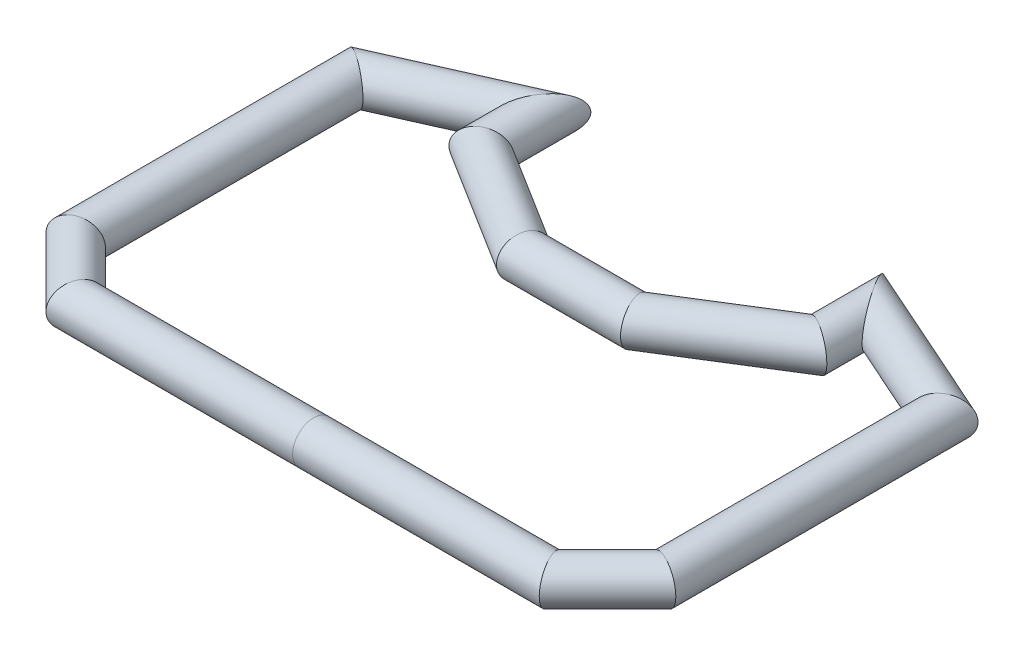
ISO-10303-21;
HEADER;
FILE_DESCRIPTION(('STEP AP214'),'2;1');
FILE_NAME('part.step','',(''),(''),'','','');
FILE_SCHEMA(('AUTOMOTIVE_DESIGN { 1 0 10303 214 1 1 1 1 }'));
ENDSEC;
DATA;
#1=APPLICATION_CONTEXT('core data for automotive mechanical design processes');
#2=APPLICATION_PROTOCOL_DEFINITION('international standard','automotive_design',2000,#1);
#3=PRODUCT_CONTEXT('',#1,'mechanical');
#4=PRODUCT('Part','Part','',(#3));
#5=PRODUCT_RELATED_PRODUCT_CATEGORY('part','',(#4));
#6=PRODUCT_DEFINITION_FORMATION('','',#4);
#7=PRODUCT_DEFINITION_CONTEXT('part definition',#1,'design');
#8=PRODUCT_DEFINITION('design','',#6,#7);
#9=PRODUCT_DEFINITION_SHAPE('','',#8);
#10=(LENGTH_UNIT() NAMED_UNIT(*) SI_UNIT(.MILLI.,.METRE.));
#11=(NAMED_UNIT(*) PLANE_ANGLE_UNIT() SI_UNIT($,.RADIAN.));
#12=(NAMED_UNIT(*) SI_UNIT($,.STERADIAN.) SOLID_ANGLE_UNIT());
#13=UNCERTAINTY_MEASURE_WITH_UNIT(LENGTH_MEASURE(1.E-05),#10,'distance_accuracy_value','');
#14=(GEOMETRIC_REPRESENTATION_CONTEXT(3) GLOBAL_UNCERTAINTY_ASSIGNED_CONTEXT((#13)) GLOBAL_UNIT_ASSIGNED_CONTEXT((#10,
#11,#12)) REPRESENTATION_CONTEXT('',''));
#15=CARTESIAN_POINT('',(0.,0.,0.));
#16=DIRECTION('',(0.,0.,1.));
#17=DIRECTION('',(1.,0.,0.));
#18=AXIS2_PLACEMENT_3D('',#15,#16,#17);
#19=CARTESIAN_POINT('',(45.618887306283,0.,186.6117534618));
#20=DIRECTION('',(0.847998304005083,0.,-0.529998940003187));
#21=DIRECTION('',(-0.529998940003187,0.,-0.847998304005083));
#22=AXIS2_PLACEMENT_3D('',#19,#20,#21);
#23=CYLINDRICAL_SURFACE('',#22,19.05);
#24=CARTESIAN_POINT('',(50.800000000001,0.,183.373558028226));
#25=DIRECTION('',(0.961248746164354,0.,-0.275682513042555));
#26=DIRECTION('',(0.275682513042555,0.,0.961248746164354));
#27=AXIS2_PLACEMENT_3D('',#24,#25,#26);
#28=ELLIPSE('',#27,19.8179712337881,19.05);
#29=CARTESIAN_POINT('',(56.2634681131368,0.,202.423558028226));
#30=VERTEX_POINT('',#29);
#31=EDGE_CURVE('E71',#30,#30,#28,.T.);
#32=ORIENTED_EDGE('',*,*,#31,.T.);
#33=EDGE_LOOP('',(#32));
#34=FACE_BOUND('',#33,.T.);
#35=CARTESIAN_POINT('',(152.400000000001,0.,119.873558028225));
#36=DIRECTION('',(0.484768532392941,0.,-0.87464248124682));
#37=DIRECTION('',(-0.87464248124682,0.,-0.484768532392941));
#38=AXIS2_PLACEMENT_3D('',#35,#36,#37);
#39=ELLIPSE('',#38,21.7803278578967,19.05);
#40=CARTESIAN_POINT('',(133.350000000001,0.,109.315140457515));
#41=VERTEX_POINT('',#40);
#42=EDGE_CURVE('E34',#41,#41,#39,.T.);
#43=ORIENTED_EDGE('',*,*,#42,.F.);
#44=EDGE_LOOP('',(#43));
#45=FACE_BOUND('',#44,.T.);
#46=ADVANCED_FACE('F31',(#34,#45),#23,.T.);
#47=CARTESIAN_POINT('',(152.400000000001,0.,131.587817356005));
#48=DIRECTION('',(0.,0.,-1.));
#49=DIRECTION('',(-1.,0.,0.));
#50=AXIS2_PLACEMENT_3D('',#47,#48,#49);
#51=CYLINDRICAL_SURFACE('',#50,19.05);
#52=ORIENTED_EDGE('',*,*,#42,.T.);
#53=EDGE_LOOP('',(#52));
#54=FACE_BOUND('',#53,.T.);
#55=CARTESIAN_POINT('',(152.400000000001,0.,69.0735580282258));
#56=DIRECTION('',(0.838492237904872,0.,-0.544913540823937));
#57=DIRECTION('',(0.544913540823937,0.,0.838492237904872));
#58=AXIS2_PLACEMENT_3D('',#55,#56,#57);
#59=ELLIPSE('',#58,34.9596744672475,19.05);
#60=CARTESIAN_POINT('',(171.450000000001,0.,98.3869737086939));
#61=VERTEX_POINT('',#60);
#62=EDGE_CURVE('E69',#61,#61,#59,.T.);
#63=ORIENTED_EDGE('',*,*,#62,.F.);
#64=EDGE_LOOP('',(#63));
#65=FACE_BOUND('',#64,.T.);
#66=ADVANCED_FACE('F78',(#54,#65),#51,.T.);
#67=CARTESIAN_POINT('',(-56.9098149244483,0.,183.373558028226));
#68=DIRECTION('',(1.,0.,0.));
#69=DIRECTION('',(0.,0.,-1.));
#70=AXIS2_PLACEMENT_3D('',#67,#68,#69);
#71=CYLINDRICAL_SURFACE('',#70,19.05);
#72=CARTESIAN_POINT('',(-50.7999999999989,0.,183.373558028226));
#73=DIRECTION('',(0.961248746164354,0.,0.275682513042555));
#74=DIRECTION('',(-0.275682513042555,0.,0.961248746164354));
#75=AXIS2_PLACEMENT_3D('',#72,#73,#74);
#76=ELLIPSE('',#75,19.8179712337881,19.05);
#77=CARTESIAN_POINT('',(-56.2634681131347,0.,202.423558028226));
#78=VERTEX_POINT('',#77);
#79=EDGE_CURVE('E66',#78,#78,#76,.T.);
#80=ORIENTED_EDGE('',*,*,#79,.T.);
#81=EDGE_LOOP('',(#80));
#82=FACE_BOUND('',#81,.T.);
#83=ORIENTED_EDGE('',*,*,#31,.F.);
#84=EDGE_LOOP('',(#83));
#85=FACE_BOUND('',#84,.T.);
#86=ADVANCED_FACE('F85',(#82,#85),#71,.T.);
#87=CARTESIAN_POINT('',(122.842987288989,0.,55.937107934443));
#88=DIRECTION('',(0.913811548620261,0.,0.40613846605344));
#89=DIRECTION('',(0.40613846605344,0.,-0.913811548620261));
#90=AXIS2_PLACEMENT_3D('',#87,#88,#89);
#91=CYLINDRICAL_SURFACE('',#90,19.05);
#92=ORIENTED_EDGE('',*,*,#62,.T.);
#93=EDGE_LOOP('',(#92));
#94=FACE_BOUND('',#93,.T.);
#95=CARTESIAN_POINT('',(266.700000000001,0.,119.873558028225));
#96=DIRECTION('',(0.544913540823937,0.,0.838492237904872));
#97=DIRECTION('',(-0.838492237904872,0.,0.544913540823937));
#98=AXIS2_PLACEMENT_3D('',#95,#96,#97);
#99=ELLIPSE('',#98,22.7193516395572,19.05);
#100=CARTESIAN_POINT('',(247.650000000001,0.,132.25364037536));
#101=VERTEX_POINT('',#100);
#102=EDGE_CURVE('E63',#101,#101,#99,.T.);
#103=ORIENTED_EDGE('',*,*,#102,.F.);
#104=EDGE_LOOP('',(#103));
#105=FACE_BOUND('',#104,.T.);
#106=ADVANCED_FACE('F124',(#94,#105),#91,.T.);
#107=CARTESIAN_POINT('',(-162.333672042633,0.,113.665013001578));
#108=DIRECTION('',(0.847998304005083,0.,0.529998940003187));
#109=DIRECTION('',(0.529998940003187,0.,-0.847998304005083));
#110=AXIS2_PLACEMENT_3D('',#107,#108,#109);
#111=CYLINDRICAL_SURFACE('',#110,19.05);
#112=CARTESIAN_POINT('',(-152.399999999999,0.,119.873558028225));
#113=DIRECTION('',(0.484768532392942,0.,0.87464248124682));
#114=DIRECTION('',(-0.87464248124682,0.,0.484768532392942));
#115=AXIS2_PLACEMENT_3D('',#112,#113,#114);
#116=ELLIPSE('',#115,21.7803278578967,19.05);
#117=CARTESIAN_POINT('',(-171.449999999999,0.,130.431975598934));
#118=VERTEX_POINT('',#117);
#119=EDGE_CURVE('E60',#118,#118,#116,.T.);
#120=ORIENTED_EDGE('',*,*,#119,.T.);
#121=EDGE_LOOP('',(#120));
#122=FACE_BOUND('',#121,.T.);
#123=ORIENTED_EDGE('',*,*,#79,.F.);
#124=EDGE_LOOP('',(#123));
#125=FACE_BOUND('',#124,.T.);
#126=ADVANCED_FACE('F120',(#122,#125),#111,.T.);
#127=CARTESIAN_POINT('',(266.700000000001,0.,106.155467446376));
#128=DIRECTION('',(0.,0.,1.));
#129=DIRECTION('',(1.,0.,0.));
#130=AXIS2_PLACEMENT_3D('',#127,#128,#129);
#131=CYLINDRICAL_SURFACE('',#130,19.05);
#132=ORIENTED_EDGE('',*,*,#102,.T.);
#133=EDGE_LOOP('',(#132));
#134=FACE_BOUND('',#133,.T.);
#135=CARTESIAN_POINT('',(266.700000000001,0.,373.873558028226));
#136=DIRECTION('',(-0.382683432365095,0.,0.923879532511285));
#137=DIRECTION('',(-0.923879532511285,0.,-0.382683432365095));
#138=AXIS2_PLACEMENT_3D('',#135,#136,#137);
#139=ELLIPSE('',#138,20.6195714155701,19.05);
#140=CARTESIAN_POINT('',(247.650000000001,0.,365.982789665018));
#141=VERTEX_POINT('',#140);
#142=EDGE_CURVE('E57',#141,#141,#139,.T.);
#143=ORIENTED_EDGE('',*,*,#142,.F.);
#144=EDGE_LOOP('',(#143));
#145=FACE_BOUND('',#144,.T.);
#146=ADVANCED_FACE('F116',(#134,#145),#131,.T.);
#147=CARTESIAN_POINT('',(-152.399999999999,0.,36.7288007797106));
#148=DIRECTION('',(0.,0.,1.));
#149=DIRECTION('',(1.,0.,0.));
#150=AXIS2_PLACEMENT_3D('',#147,#148,#149);
#151=CYLINDRICAL_SURFACE('',#150,19.05);
#152=CARTESIAN_POINT('',(-152.399999999999,0.,69.0735580282258));
#153=DIRECTION('',(0.838492237904872,0.,0.544913540823936));
#154=DIRECTION('',(0.544913540823936,0.,-0.838492237904872));
#155=AXIS2_PLACEMENT_3D('',#152,#153,#154);
#156=ELLIPSE('',#155,34.9596744672474,19.05);
#157=CARTESIAN_POINT('',(-133.349999999999,0.,39.7601423477577));
#158=VERTEX_POINT('',#157);
#159=EDGE_CURVE('E54',#158,#158,#156,.T.);
#160=ORIENTED_EDGE('',*,*,#159,.T.);
#161=EDGE_LOOP('',(#160));
#162=FACE_BOUND('',#161,.T.);
#163=ORIENTED_EDGE('',*,*,#119,.F.);
#164=EDGE_LOOP('',(#163));
#165=FACE_BOUND('',#164,.T.);
#166=ADVANCED_FACE('F112',(#162,#165),#151,.T.);
#167=CARTESIAN_POINT('',(272.908288078356,0.,367.665269949871));
#168=DIRECTION('',(-0.707106781186555,0.,0.70710678118654));
#169=DIRECTION('',(0.70710678118654,0.,0.707106781186555));
#170=AXIS2_PLACEMENT_3D('',#167,#168,#169);
#171=CYLINDRICAL_SURFACE('',#170,19.05);
#172=ORIENTED_EDGE('',*,*,#142,.T.);
#173=EDGE_LOOP('',(#172));
#174=FACE_BOUND('',#173,.T.);
#175=CARTESIAN_POINT('',(215.900000000001,0.,424.673558028225));
#176=DIRECTION('',(-0.923879532511289,0.,0.382683432365085));
#177=DIRECTION('',(-0.382683432365085,0.,-0.923879532511289));
#178=AXIS2_PLACEMENT_3D('',#175,#176,#177);
#179=ELLIPSE('',#178,20.61957141557,19.05);
#180=CARTESIAN_POINT('',(208.009231636794,0.,405.623558028225));
#181=VERTEX_POINT('',#180);
#182=EDGE_CURVE('E48',#181,#181,#179,.T.);
#183=ORIENTED_EDGE('',*,*,#182,.F.);
#184=EDGE_LOOP('',(#183));
#185=FACE_BOUND('',#184,.T.);
#186=ADVANCED_FACE('F108',(#174,#185),#171,.T.);
#187=CARTESIAN_POINT('',(-279.235749598711,0.,125.445002294319));
#188=DIRECTION('',(0.913811548620261,0.,-0.40613846605344));
#189=DIRECTION('',(-0.40613846605344,0.,-0.913811548620261));
#190=AXIS2_PLACEMENT_3D('',#187,#188,#189);
#191=CYLINDRICAL_SURFACE('',#190,19.05);
#192=CARTESIAN_POINT('',(-266.699999999999,0.,119.873558028225));
#193=DIRECTION('',(0.544913540823937,0.,-0.838492237904872));
#194=DIRECTION('',(-0.838492237904872,0.,-0.544913540823937));
#195=AXIS2_PLACEMENT_3D('',#192,#193,#194);
#196=ELLIPSE('',#195,22.7193516395572,19.05);
#197=CARTESIAN_POINT('',(-285.749999999999,0.,107.493475681089));
#198=VERTEX_POINT('',#197);
#199=EDGE_CURVE('E43',#198,#198,#196,.T.);
#200=ORIENTED_EDGE('',*,*,#199,.T.);
#201=EDGE_LOOP('',(#200));
#202=FACE_BOUND('',#201,.T.);
#203=ORIENTED_EDGE('',*,*,#159,.F.);
#204=EDGE_LOOP('',(#203));
#205=FACE_BOUND('',#204,.T.);
#206=ADVANCED_FACE('F101',(#202,#205),#191,.T.);
#207=CARTESIAN_POINT('',(224.679845199529,0.,424.673558028225));
#208=DIRECTION('',(-1.,0.,0.));
#209=DIRECTION('',(0.,0.,1.));
#210=AXIS2_PLACEMENT_3D('',#207,#208,#209);
#211=CYLINDRICAL_SURFACE('',#210,19.05);
#212=ORIENTED_EDGE('',*,*,#182,.T.);
#213=EDGE_LOOP('',(#212));
#214=FACE_BOUND('',#213,.T.);
#215=CARTESIAN_POINT('',(0.,0.,424.673558028225));
#216=DIRECTION('',(1.,0.,0.));
#217=DIRECTION('',(0.,0.,-1.));
#218=AXIS2_PLACEMENT_3D('',#215,#216,#217);
#219=CIRCLE('',#218,19.05);
#220=CARTESIAN_POINT('',(0.,0.,405.623558028225));
#221=VERTEX_POINT('',#220);
#222=EDGE_CURVE('E51',#221,#221,#219,.T.);
#223=ORIENTED_EDGE('',*,*,#222,.T.);
#224=EDGE_LOOP('',(#223));
#225=FACE_BOUND('',#224,.T.);
#226=ADVANCED_FACE('F98',(#214,#225),#211,.T.);
#227=CARTESIAN_POINT('',(0.,0.,424.673558028225));
#228=DIRECTION('',(-1.,0.,0.));
#229=DIRECTION('',(0.,0.,1.));
#230=AXIS2_PLACEMENT_3D('',#227,#228,#229);
#231=CYLINDRICAL_SURFACE('',#230,19.05);
#232=ORIENTED_EDGE('',*,*,#222,.F.);
#233=EDGE_LOOP('',(#232));
#234=FACE_BOUND('',#233,.T.);
#235=CARTESIAN_POINT('',(-215.899999999999,0.,424.673558028225));
#236=DIRECTION('',(-0.923879532511289,0.,-0.382683432365085));
#237=DIRECTION('',(0.382683432365085,0.,-0.923879532511289));
#238=AXIS2_PLACEMENT_3D('',#235,#236,#237);
#239=ELLIPSE('',#238,20.6195714155701,19.05);
#240=CARTESIAN_POINT('',(-208.009231636792,0.,405.623558028225));
#241=VERTEX_POINT('',#240);
#242=EDGE_CURVE('E38',#241,#241,#239,.T.);
#243=ORIENTED_EDGE('',*,*,#242,.F.);
#244=EDGE_LOOP('',(#243));
#245=FACE_BOUND('',#244,.T.);
#246=ADVANCED_FACE('F94',(#234,#245),#231,.T.);
#247=CARTESIAN_POINT('',(-266.699999999999,0.,382.653403227754));
#248=DIRECTION('',(0.,0.,-1.));
#249=DIRECTION('',(-1.,0.,0.));
#250=AXIS2_PLACEMENT_3D('',#247,#248,#249);
#251=CYLINDRICAL_SURFACE('',#250,19.05);
#252=CARTESIAN_POINT('',(-266.699999999999,0.,373.873558028226));
#253=DIRECTION('',(-0.382683432365095,0.,-0.923879532511285));
#254=DIRECTION('',(-0.923879532511285,0.,0.382683432365095));
#255=AXIS2_PLACEMENT_3D('',#252,#253,#254);
#256=ELLIPSE('',#255,20.6195714155701,19.05);
#257=CARTESIAN_POINT('',(-285.749999999999,0.,381.764326391433));
#258=VERTEX_POINT('',#257);
#259=EDGE_CURVE('E10',#258,#258,#256,.T.);
#260=ORIENTED_EDGE('',*,*,#259,.T.);
#261=EDGE_LOOP('',(#260));
#262=FACE_BOUND('',#261,.T.);
#263=ORIENTED_EDGE('',*,*,#199,.F.);
#264=EDGE_LOOP('',(#263));
#265=FACE_BOUND('',#264,.T.);
#266=ADVANCED_FACE('F88',(#262,#265),#251,.T.);
#267=CARTESIAN_POINT('',(-209.691711921644,0.,430.881846106579));
#268=DIRECTION('',(-0.707106781186555,0.,-0.707106781186539));
#269=DIRECTION('',(-0.70710678118654,0.,0.707106781186556));
#270=AXIS2_PLACEMENT_3D('',#267,#268,#269);
#271=CYLINDRICAL_SURFACE('',#270,19.05);
#272=ORIENTED_EDGE('',*,*,#242,.T.);
#273=EDGE_LOOP('',(#272));
#274=FACE_BOUND('',#273,.T.);
#275=ORIENTED_EDGE('',*,*,#259,.F.);
#276=EDGE_LOOP('',(#275));
#277=FACE_BOUND('',#276,.T.);
#278=ADVANCED_FACE('F86',(#274,#277),#271,.T.);
#279=CLOSED_SHELL('',(#46,#66,#86,#106,#126,#146,#166,#186,#206,#226,#246,#266,#278));
#280=MANIFOLD_SOLID_BREP('B2',#279);
#281=ADVANCED_BREP_SHAPE_REPRESENTATION('',(#18,#280),#14);
#282=SHAPE_DEFINITION_REPRESENTATION(#9,#281);
ENDSEC;
END-ISO-10303-21;
